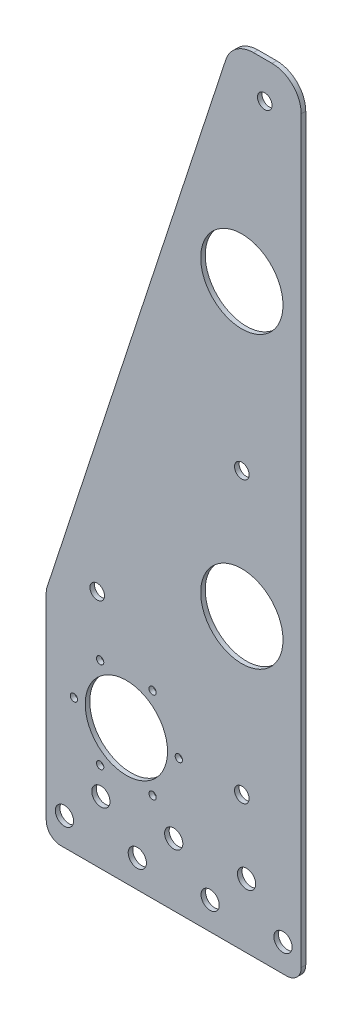
ISO-10303-21;
HEADER;
FILE_DESCRIPTION(('STEP AP214'),'2;1');
FILE_NAME('part.step','',(''),(''),'','','');
FILE_SCHEMA(('AUTOMOTIVE_DESIGN { 1 0 10303 214 1 1 1 1 }'));
ENDSEC;
DATA;
#1=APPLICATION_CONTEXT('core data for automotive mechanical design processes');
#2=APPLICATION_PROTOCOL_DEFINITION('international standard','automotive_design',2000,#1);
#3=PRODUCT_CONTEXT('',#1,'mechanical');
#4=PRODUCT('Part','Part','',(#3));
#5=PRODUCT_RELATED_PRODUCT_CATEGORY('part','',(#4));
#6=PRODUCT_DEFINITION_FORMATION('','',#4);
#7=PRODUCT_DEFINITION_CONTEXT('part definition',#1,'design');
#8=PRODUCT_DEFINITION('design','',#6,#7);
#9=PRODUCT_DEFINITION_SHAPE('','',#8);
#10=(LENGTH_UNIT() NAMED_UNIT(*) SI_UNIT(.MILLI.,.METRE.));
#11=(NAMED_UNIT(*) PLANE_ANGLE_UNIT() SI_UNIT($,.RADIAN.));
#12=(NAMED_UNIT(*) SI_UNIT($,.STERADIAN.) SOLID_ANGLE_UNIT());
#13=UNCERTAINTY_MEASURE_WITH_UNIT(LENGTH_MEASURE(1.E-05),#10,'distance_accuracy_value','');
#14=(GEOMETRIC_REPRESENTATION_CONTEXT(3) GLOBAL_UNCERTAINTY_ASSIGNED_CONTEXT((#13)) GLOBAL_UNIT_ASSIGNED_CONTEXT((#10,
#11,#12)) REPRESENTATION_CONTEXT('',''));
#15=CARTESIAN_POINT('',(0.,0.,0.));
#16=DIRECTION('',(0.,0.,1.));
#17=DIRECTION('',(1.,0.,0.));
#18=AXIS2_PLACEMENT_3D('',#15,#16,#17);
#19=CARTESIAN_POINT('',(55.6253139352506,212.09,1.5875));
#20=DIRECTION('',(0.,0.,1.));
#21=DIRECTION('',(1.,0.,0.));
#22=AXIS2_PLACEMENT_3D('',#19,#20,#21);
#23=PLANE('',#22);
#24=CARTESIAN_POINT('',(17.7799999999999,83.058,1.5875));
#25=DIRECTION('',(0.,0.,1.));
#26=DIRECTION('',(1.,0.,0.));
#27=AXIS2_PLACEMENT_3D('',#24,#25,#26);
#28=CIRCLE('',#27,2.53999999999999);
#29=CARTESIAN_POINT('',(20.3199999999999,83.058,1.5875));
#30=VERTEX_POINT('',#29);
#31=EDGE_CURVE('E336',#30,#30,#28,.T.);
#32=ORIENTED_EDGE('',*,*,#31,.F.);
#33=EDGE_LOOP('',(#32));
#34=FACE_BOUND('',#33,.T.);
#35=DIRECTION('',(0.,1.,0.));
#36=VECTOR('',#35,1.);
#37=CARTESIAN_POINT('',(88.8999999999999,212.09,1.5875));
#38=LINE('',#37,#36);
#39=CARTESIAN_POINT('',(88.9000000000002,5.08000000000001,1.5875));
#40=VERTEX_POINT('',#39);
#41=CARTESIAN_POINT('',(88.9000000000002,262.89,1.5875));
#42=VERTEX_POINT('',#41);
#43=EDGE_CURVE('E122',#40,#42,#38,.T.);
#44=ORIENTED_EDGE('',*,*,#43,.T.);
#45=CARTESIAN_POINT('',(78.7400000000002,262.89,1.5875));
#46=DIRECTION('',(0.,0.,1.));
#47=DIRECTION('',(-1.,0.,0.));
#48=AXIS2_PLACEMENT_3D('',#45,#46,#47);
#49=CIRCLE('',#48,10.16);
#50=CARTESIAN_POINT('',(78.7400000000002,273.05,1.5875));
#51=VERTEX_POINT('',#50);
#52=EDGE_CURVE('E175',#42,#51,#49,.T.);
#53=ORIENTED_EDGE('',*,*,#52,.T.);
#54=DIRECTION('',(-1.,0.,0.));
#55=VECTOR('',#54,1.);
#56=CARTESIAN_POINT('',(72.2497752500611,273.05,1.5875));
#57=LINE('',#56,#55);
#58=CARTESIAN_POINT('',(72.2497752500611,273.05,1.5875));
#59=VERTEX_POINT('',#58);
#60=EDGE_CURVE('E318',#51,#59,#57,.T.);
#61=ORIENTED_EDGE('',*,*,#60,.T.);
#62=CARTESIAN_POINT('',(72.2497752500611,262.89,1.5875));
#63=DIRECTION('',(0.,0.,1.));
#64=DIRECTION('',(-1.,0.,0.));
#65=AXIS2_PLACEMENT_3D('',#62,#63,#64);
#66=CIRCLE('',#65,10.16);
#67=CARTESIAN_POINT('',(62.5936846110183,266.049986324431,1.5875));
#68=VERTEX_POINT('',#67);
#69=EDGE_CURVE('E320',#59,#68,#66,.T.);
#70=ORIENTED_EDGE('',*,*,#69,.T.);
#71=DIRECTION('',(-0.311022276026631,-0.95040262195304,0.));
#72=VECTOR('',#71,1.);
#73=CARTESIAN_POINT('',(45.9692232962077,215.249986324431,1.5875));
#74=LINE('',#73,#72);
#75=CARTESIAN_POINT('',(0.251954680478576,75.5499863244306,1.5875));
#76=VERTEX_POINT('',#75);
#77=EDGE_CURVE('E91',#68,#76,#74,.T.);
#78=ORIENTED_EDGE('',*,*,#77,.T.);
#79=CARTESIAN_POINT('',(5.08,73.9699931622152,1.5875));
#80=DIRECTION('',(0.,0.,1.));
#81=DIRECTION('',(1.,0.,0.));
#82=AXIS2_PLACEMENT_3D('',#79,#80,#81);
#83=CIRCLE('',#82,5.08);
#84=CARTESIAN_POINT('',(0.,73.9699931622152,1.5875));
#85=VERTEX_POINT('',#84);
#86=EDGE_CURVE('E295',#76,#85,#83,.T.);
#87=ORIENTED_EDGE('',*,*,#86,.T.);
#88=DIRECTION('',(0.,-1.,0.));
#89=VECTOR('',#88,1.);
#90=CARTESIAN_POINT('',(0.,73.9699931622152,1.5875));
#91=LINE('',#90,#89);
#92=CARTESIAN_POINT('',(0.,5.07999999999999,1.5875));
#93=VERTEX_POINT('',#92);
#94=EDGE_CURVE('E108',#85,#93,#91,.T.);
#95=ORIENTED_EDGE('',*,*,#94,.T.);
#96=CARTESIAN_POINT('',(5.08000000000002,5.07999999999999,1.5875));
#97=DIRECTION('',(0.,0.,1.));
#98=DIRECTION('',(1.,0.,0.));
#99=AXIS2_PLACEMENT_3D('',#96,#97,#98);
#100=CIRCLE('',#99,5.08);
#101=CARTESIAN_POINT('',(5.08000000000002,0.,1.5875));
#102=VERTEX_POINT('',#101);
#103=EDGE_CURVE('E102',#93,#102,#100,.T.);
#104=ORIENTED_EDGE('',*,*,#103,.T.);
#105=DIRECTION('',(1.,0.,0.));
#106=VECTOR('',#105,1.);
#107=CARTESIAN_POINT('',(83.82,0.,1.5875));
#108=LINE('',#107,#106);
#109=CARTESIAN_POINT('',(83.82,-1.04083408558608E-13,1.5875));
#110=VERTEX_POINT('',#109);
#111=EDGE_CURVE('E106',#102,#110,#108,.T.);
#112=ORIENTED_EDGE('',*,*,#111,.T.);
#113=CARTESIAN_POINT('',(83.82,5.08,1.5875));
#114=DIRECTION('',(0.,0.,1.));
#115=DIRECTION('',(-1.,0.,0.));
#116=AXIS2_PLACEMENT_3D('',#113,#114,#115);
#117=CIRCLE('',#116,5.0800000000001);
#118=EDGE_CURVE('E53',#110,#40,#117,.T.);
#119=ORIENTED_EDGE('',*,*,#118,.T.);
#120=EDGE_LOOP('',(#44,#53,#61,#70,#78,#87,#95,#104,#112,#119));
#121=FACE_BOUND('',#120,.T.);
#122=CARTESIAN_POINT('',(18.7960000000001,62.8278725844102,1.5875));
#123=DIRECTION('',(0.,0.,1.));
#124=DIRECTION('',(1.,0.,0.));
#125=AXIS2_PLACEMENT_3D('',#122,#123,#124);
#126=CIRCLE('',#125,1.27000000000001);
#127=CARTESIAN_POINT('',(20.0660000000001,62.8278725844102,1.5875));
#128=VERTEX_POINT('',#127);
#129=EDGE_CURVE('E194',#128,#128,#126,.T.);
#130=ORIENTED_EDGE('',*,*,#129,.F.);
#131=EDGE_LOOP('',(#130));
#132=FACE_BOUND('',#131,.T.);
#133=CARTESIAN_POINT('',(44.45,21.844,1.5875));
#134=DIRECTION('',(0.,0.,1.));
#135=DIRECTION('',(-1.,0.,0.));
#136=AXIS2_PLACEMENT_3D('',#133,#134,#135);
#137=CIRCLE('',#136,3.175);
#138=CARTESIAN_POINT('',(41.275,21.844,1.5875));
#139=VERTEX_POINT('',#138);
#140=EDGE_CURVE('E206',#139,#139,#137,.T.);
#141=ORIENTED_EDGE('',*,*,#140,.F.);
#142=EDGE_LOOP('',(#141));
#143=FACE_BOUND('',#142,.T.);
#144=CARTESIAN_POINT('',(9.65199999999989,46.9900000000005,1.5875));
#145=DIRECTION('',(0.,0.,1.));
#146=DIRECTION('',(1.,0.,0.));
#147=AXIS2_PLACEMENT_3D('',#144,#145,#146);
#148=CIRCLE('',#147,1.27);
#149=CARTESIAN_POINT('',(10.9219999999999,46.9900000000005,1.5875));
#150=VERTEX_POINT('',#149);
#151=EDGE_CURVE('E218',#150,#150,#148,.T.);
#152=ORIENTED_EDGE('',*,*,#151,.F.);
#153=EDGE_LOOP('',(#152));
#154=FACE_BOUND('',#153,.T.);
#155=CARTESIAN_POINT('',(82.55,9.652,1.5875));
#156=DIRECTION('',(0.,0.,1.));
#157=DIRECTION('',(1.,0.,0.));
#158=AXIS2_PLACEMENT_3D('',#155,#156,#157);
#159=CIRCLE('',#158,3.175);
#160=CARTESIAN_POINT('',(85.725,9.652,1.5875));
#161=VERTEX_POINT('',#160);
#162=EDGE_CURVE('E230',#161,#161,#159,.T.);
#163=ORIENTED_EDGE('',*,*,#162,.F.);
#164=EDGE_LOOP('',(#163));
#165=FACE_BOUND('',#164,.T.);
#166=CARTESIAN_POINT('',(31.75,9.652,1.5875));
#167=DIRECTION('',(0.,0.,1.));
#168=DIRECTION('',(1.,0.,0.));
#169=AXIS2_PLACEMENT_3D('',#166,#167,#168);
#170=CIRCLE('',#169,3.175);
#171=CARTESIAN_POINT('',(34.925,9.652,1.5875));
#172=VERTEX_POINT('',#171);
#173=EDGE_CURVE('E242',#172,#172,#170,.T.);
#174=ORIENTED_EDGE('',*,*,#173,.F.);
#175=EDGE_LOOP('',(#174));
#176=FACE_BOUND('',#175,.T.);
#177=CARTESIAN_POINT('',(6.34999999999999,9.652,1.5875));
#178=DIRECTION('',(0.,0.,1.));
#179=DIRECTION('',(1.,0.,0.));
#180=AXIS2_PLACEMENT_3D('',#177,#178,#179);
#181=CIRCLE('',#180,3.175);
#182=CARTESIAN_POINT('',(9.525,9.652,1.5875));
#183=VERTEX_POINT('',#182);
#184=EDGE_CURVE('E254',#183,#183,#181,.T.);
#185=ORIENTED_EDGE('',*,*,#184,.F.);
#186=EDGE_LOOP('',(#185));
#187=FACE_BOUND('',#186,.T.);
#188=CARTESIAN_POINT('',(27.9399999999999,46.99,1.5875));
#189=DIRECTION('',(0.,0.,1.));
#190=DIRECTION('',(1.,0.,0.));
#191=AXIS2_PLACEMENT_3D('',#188,#189,#190);
#192=CIRCLE('',#191,14.351);
#193=CARTESIAN_POINT('',(42.291,46.99,1.5875));
#194=VERTEX_POINT('',#193);
#195=EDGE_CURVE('E266',#194,#194,#192,.T.);
#196=ORIENTED_EDGE('',*,*,#195,.F.);
#197=EDGE_LOOP('',(#196));
#198=FACE_BOUND('',#197,.T.);
#199=CARTESIAN_POINT('',(68.199,46.99,1.5875));
#200=DIRECTION('',(0.,0.,1.));
#201=DIRECTION('',(1.,0.,0.));
#202=AXIS2_PLACEMENT_3D('',#199,#200,#201);
#203=CIRCLE('',#202,2.54);
#204=CARTESIAN_POINT('',(70.739,46.99,1.5875));
#205=VERTEX_POINT('',#204);
#206=EDGE_CURVE('E278',#205,#205,#203,.T.);
#207=ORIENTED_EDGE('',*,*,#206,.F.);
#208=EDGE_LOOP('',(#207));
#209=FACE_BOUND('',#208,.T.);
#210=CARTESIAN_POINT('',(68.199,201.93,1.5875));
#211=DIRECTION('',(0.,0.,1.));
#212=DIRECTION('',(1.,0.,0.));
#213=AXIS2_PLACEMENT_3D('',#210,#211,#212);
#214=CIRCLE('',#213,14.351);
#215=CARTESIAN_POINT('',(82.5499999999999,201.93,1.5875));
#216=VERTEX_POINT('',#215);
#217=EDGE_CURVE('E131',#216,#216,#214,.T.);
#218=ORIENTED_EDGE('',*,*,#217,.F.);
#219=EDGE_LOOP('',(#218));
#220=FACE_BOUND('',#219,.T.);
#221=CARTESIAN_POINT('',(68.199,100.838,1.5875));
#222=DIRECTION('',(0.,0.,1.));
#223=DIRECTION('',(1.,0.,0.));
#224=AXIS2_PLACEMENT_3D('',#221,#222,#223);
#225=CIRCLE('',#224,14.351);
#226=CARTESIAN_POINT('',(82.55,100.838,1.5875));
#227=VERTEX_POINT('',#226);
#228=EDGE_CURVE('E284',#227,#227,#225,.T.);
#229=ORIENTED_EDGE('',*,*,#228,.F.);
#230=EDGE_LOOP('',(#229));
#231=FACE_BOUND('',#230,.T.);
#232=CARTESIAN_POINT('',(68.199,144.78,1.5875));
#233=DIRECTION('',(0.,0.,1.));
#234=DIRECTION('',(1.,0.,0.));
#235=AXIS2_PLACEMENT_3D('',#232,#233,#234);
#236=CIRCLE('',#235,2.54);
#237=CARTESIAN_POINT('',(70.739,144.78,1.5875));
#238=VERTEX_POINT('',#237);
#239=EDGE_CURVE('E272',#238,#238,#236,.T.);
#240=ORIENTED_EDGE('',*,*,#239,.F.);
#241=EDGE_LOOP('',(#240));
#242=FACE_BOUND('',#241,.T.);
#243=CARTESIAN_POINT('',(46.2279999999999,46.99,1.5875));
#244=DIRECTION('',(0.,0.,1.));
#245=DIRECTION('',(1.,0.,0.));
#246=AXIS2_PLACEMENT_3D('',#243,#244,#245);
#247=CIRCLE('',#246,1.27);
#248=CARTESIAN_POINT('',(47.4979999999999,46.99,1.5875));
#249=VERTEX_POINT('',#248);
#250=EDGE_CURVE('E260',#249,#249,#247,.T.);
#251=ORIENTED_EDGE('',*,*,#250,.F.);
#252=EDGE_LOOP('',(#251));
#253=FACE_BOUND('',#252,.T.);
#254=CARTESIAN_POINT('',(37.0839999999997,31.1521274155903,1.5875));
#255=DIRECTION('',(0.,0.,1.));
#256=DIRECTION('',(1.,0.,0.));
#257=AXIS2_PLACEMENT_3D('',#254,#255,#256);
#258=CIRCLE('',#257,1.27000000000014);
#259=CARTESIAN_POINT('',(38.3539999999998,31.1521274155903,1.5875));
#260=VERTEX_POINT('',#259);
#261=EDGE_CURVE('E248',#260,#260,#258,.T.);
#262=ORIENTED_EDGE('',*,*,#261,.F.);
#263=EDGE_LOOP('',(#262));
#264=FACE_BOUND('',#263,.T.);
#265=CARTESIAN_POINT('',(57.15,9.652,1.5875));
#266=DIRECTION('',(0.,0.,1.));
#267=DIRECTION('',(1.,0.,0.));
#268=AXIS2_PLACEMENT_3D('',#265,#266,#267);
#269=CIRCLE('',#268,3.17500000000001);
#270=CARTESIAN_POINT('',(60.325,9.652,1.5875));
#271=VERTEX_POINT('',#270);
#272=EDGE_CURVE('E236',#271,#271,#269,.T.);
#273=ORIENTED_EDGE('',*,*,#272,.F.);
#274=EDGE_LOOP('',(#273));
#275=FACE_BOUND('',#274,.T.);
#276=CARTESIAN_POINT('',(18.7959999999997,31.1521274155905,1.5875));
#277=DIRECTION('',(0.,0.,1.));
#278=DIRECTION('',(1.,0.,0.));
#279=AXIS2_PLACEMENT_3D('',#276,#277,#278);
#280=CIRCLE('',#279,1.27);
#281=CARTESIAN_POINT('',(20.0659999999997,31.1521274155905,1.5875));
#282=VERTEX_POINT('',#281);
#283=EDGE_CURVE('E224',#282,#282,#280,.T.);
#284=ORIENTED_EDGE('',*,*,#283,.F.);
#285=EDGE_LOOP('',(#284));
#286=FACE_BOUND('',#285,.T.);
#287=CARTESIAN_POINT('',(69.85,22.352,1.5875));
#288=DIRECTION('',(0.,0.,1.));
#289=DIRECTION('',(-1.,0.,0.));
#290=AXIS2_PLACEMENT_3D('',#287,#288,#289);
#291=CIRCLE('',#290,3.175);
#292=CARTESIAN_POINT('',(66.675,22.352,1.5875));
#293=VERTEX_POINT('',#292);
#294=EDGE_CURVE('E212',#293,#293,#291,.T.);
#295=ORIENTED_EDGE('',*,*,#294,.F.);
#296=EDGE_LOOP('',(#295));
#297=FACE_BOUND('',#296,.T.);
#298=CARTESIAN_POINT('',(19.05,21.844,1.5875));
#299=DIRECTION('',(0.,0.,1.));
#300=DIRECTION('',(-1.,0.,0.));
#301=AXIS2_PLACEMENT_3D('',#298,#299,#300);
#302=CIRCLE('',#301,3.175);
#303=CARTESIAN_POINT('',(15.875,21.844,1.5875));
#304=VERTEX_POINT('',#303);
#305=EDGE_CURVE('E200',#304,#304,#302,.T.);
#306=ORIENTED_EDGE('',*,*,#305,.F.);
#307=EDGE_LOOP('',(#306));
#308=FACE_BOUND('',#307,.T.);
#309=CARTESIAN_POINT('',(37.0840000000001,62.8278725844099,1.5875));
#310=DIRECTION('',(0.,0.,1.));
#311=DIRECTION('',(1.,0.,0.));
#312=AXIS2_PLACEMENT_3D('',#309,#310,#311);
#313=CIRCLE('',#312,1.26999999999977);
#314=CARTESIAN_POINT('',(38.3539999999999,62.8278725844099,1.5875));
#315=VERTEX_POINT('',#314);
#316=EDGE_CURVE('E186',#315,#315,#313,.T.);
#317=ORIENTED_EDGE('',*,*,#316,.F.);
#318=EDGE_LOOP('',(#317));
#319=FACE_BOUND('',#318,.T.);
#320=CARTESIAN_POINT('',(76.2000000000002,260.35,1.5875));
#321=DIRECTION('',(0.,0.,1.));
#322=DIRECTION('',(1.,0.,0.));
#323=AXIS2_PLACEMENT_3D('',#320,#321,#322);
#324=CIRCLE('',#323,2.54);
#325=CARTESIAN_POINT('',(78.7400000000002,260.35,1.5875));
#326=VERTEX_POINT('',#325);
#327=EDGE_CURVE('E330',#326,#326,#324,.T.);
#328=ORIENTED_EDGE('',*,*,#327,.F.);
#329=EDGE_LOOP('',(#328));
#330=FACE_BOUND('',#329,.T.);
#331=ADVANCED_FACE('F36',(#34,#121,#132,#143,#154,#165,#176,#187,#198,#209,#220,#231,#242,#253,
#264,#275,#286,#297,#308,#319,#330),#23,.T.);
#332=CARTESIAN_POINT('',(55.6253139352506,212.09,0.));
#333=DIRECTION('',(0.,0.,1.));
#334=DIRECTION('',(1.,0.,0.));
#335=AXIS2_PLACEMENT_3D('',#332,#333,#334);
#336=PLANE('',#335);
#337=CARTESIAN_POINT('',(17.7799999999999,83.058,0.));
#338=DIRECTION('',(0.,0.,1.));
#339=DIRECTION('',(1.,0.,0.));
#340=AXIS2_PLACEMENT_3D('',#337,#338,#339);
#341=CIRCLE('',#340,2.53999999999999);
#342=CARTESIAN_POINT('',(20.3199999999999,83.058,0.));
#343=VERTEX_POINT('',#342);
#344=EDGE_CURVE('E333',#343,#343,#341,.T.);
#345=ORIENTED_EDGE('',*,*,#344,.T.);
#346=EDGE_LOOP('',(#345));
#347=FACE_BOUND('',#346,.T.);
#348=CARTESIAN_POINT('',(78.7400000000002,262.89,0.));
#349=DIRECTION('',(0.,0.,1.));
#350=DIRECTION('',(-1.,0.,0.));
#351=AXIS2_PLACEMENT_3D('',#348,#349,#350);
#352=CIRCLE('',#351,10.16);
#353=CARTESIAN_POINT('',(88.9000000000002,262.89,0.));
#354=VERTEX_POINT('',#353);
#355=CARTESIAN_POINT('',(78.7400000000002,273.05,0.));
#356=VERTEX_POINT('',#355);
#357=EDGE_CURVE('E160',#354,#356,#352,.T.);
#358=ORIENTED_EDGE('',*,*,#357,.F.);
#359=DIRECTION('',(0.,1.,0.));
#360=VECTOR('',#359,1.);
#361=CARTESIAN_POINT('',(88.8999999999999,212.09,0.));
#362=LINE('',#361,#360);
#363=CARTESIAN_POINT('',(88.9000000000002,5.08000000000001,0.));
#364=VERTEX_POINT('',#363);
#365=EDGE_CURVE('E138',#364,#354,#362,.T.);
#366=ORIENTED_EDGE('',*,*,#365,.F.);
#367=CARTESIAN_POINT('',(83.82,5.08,0.));
#368=DIRECTION('',(0.,0.,1.));
#369=DIRECTION('',(-1.,0.,0.));
#370=AXIS2_PLACEMENT_3D('',#367,#368,#369);
#371=CIRCLE('',#370,5.0800000000001);
#372=CARTESIAN_POINT('',(83.82,-1.04083408558608E-13,0.));
#373=VERTEX_POINT('',#372);
#374=EDGE_CURVE('E83',#373,#364,#371,.T.);
#375=ORIENTED_EDGE('',*,*,#374,.F.);
#376=DIRECTION('',(1.,0.,0.));
#377=VECTOR('',#376,1.);
#378=CARTESIAN_POINT('',(83.82,0.,0.));
#379=LINE('',#378,#377);
#380=CARTESIAN_POINT('',(5.08000000000002,0.,0.));
#381=VERTEX_POINT('',#380);
#382=EDGE_CURVE('E77',#381,#373,#379,.T.);
#383=ORIENTED_EDGE('',*,*,#382,.F.);
#384=CARTESIAN_POINT('',(5.08000000000002,5.07999999999999,0.));
#385=DIRECTION('',(0.,0.,1.));
#386=DIRECTION('',(1.,0.,0.));
#387=AXIS2_PLACEMENT_3D('',#384,#385,#386);
#388=CIRCLE('',#387,5.08);
#389=CARTESIAN_POINT('',(0.,5.07999999999999,0.));
#390=VERTEX_POINT('',#389);
#391=EDGE_CURVE('E116',#390,#381,#388,.T.);
#392=ORIENTED_EDGE('',*,*,#391,.F.);
#393=DIRECTION('',(0.,-1.,0.));
#394=VECTOR('',#393,1.);
#395=CARTESIAN_POINT('',(0.,73.9699931622152,0.));
#396=LINE('',#395,#394);
#397=CARTESIAN_POINT('',(0.,73.9699931622152,0.));
#398=VERTEX_POINT('',#397);
#399=EDGE_CURVE('E133',#398,#390,#396,.T.);
#400=ORIENTED_EDGE('',*,*,#399,.F.);
#401=CARTESIAN_POINT('',(5.08,73.9699931622152,0.));
#402=DIRECTION('',(0.,0.,1.));
#403=DIRECTION('',(1.,0.,0.));
#404=AXIS2_PLACEMENT_3D('',#401,#402,#403);
#405=CIRCLE('',#404,5.08);
#406=CARTESIAN_POINT('',(0.251954680478576,75.5499863244306,0.));
#407=VERTEX_POINT('',#406);
#408=EDGE_CURVE('E130',#407,#398,#405,.T.);
#409=ORIENTED_EDGE('',*,*,#408,.F.);
#410=DIRECTION('',(-0.311022276026631,-0.95040262195304,0.));
#411=VECTOR('',#410,1.);
#412=CARTESIAN_POINT('',(45.9692232962077,215.249986324431,0.));
#413=LINE('',#412,#411);
#414=CARTESIAN_POINT('',(62.5936846110183,266.049986324431,0.));
#415=VERTEX_POINT('',#414);
#416=EDGE_CURVE('E128',#415,#407,#413,.T.);
#417=ORIENTED_EDGE('',*,*,#416,.F.);
#418=CARTESIAN_POINT('',(72.2497752500611,262.89,0.));
#419=DIRECTION('',(0.,0.,1.));
#420=DIRECTION('',(-1.,0.,0.));
#421=AXIS2_PLACEMENT_3D('',#418,#419,#420);
#422=CIRCLE('',#421,10.16);
#423=CARTESIAN_POINT('',(72.2497752500611,273.05,0.));
#424=VERTEX_POINT('',#423);
#425=EDGE_CURVE('E177',#424,#415,#422,.T.);
#426=ORIENTED_EDGE('',*,*,#425,.F.);
#427=DIRECTION('',(-1.,0.,0.));
#428=VECTOR('',#427,1.);
#429=CARTESIAN_POINT('',(72.2497752500611,273.05,0.));
#430=LINE('',#429,#428);
#431=EDGE_CURVE('E182',#356,#424,#430,.T.);
#432=ORIENTED_EDGE('',*,*,#431,.F.);
#433=EDGE_LOOP('',(#358,#366,#375,#383,#392,#400,#409,#417,#426,#432));
#434=FACE_BOUND('',#433,.T.);
#435=CARTESIAN_POINT('',(68.199,201.93,0.));
#436=DIRECTION('',(0.,0.,1.));
#437=DIRECTION('',(1.,0.,0.));
#438=AXIS2_PLACEMENT_3D('',#435,#436,#437);
#439=CIRCLE('',#438,14.351);
#440=CARTESIAN_POINT('',(82.5499999999999,201.93,0.));
#441=VERTEX_POINT('',#440);
#442=EDGE_CURVE('E287',#441,#441,#439,.T.);
#443=ORIENTED_EDGE('',*,*,#442,.T.);
#444=EDGE_LOOP('',(#443));
#445=FACE_BOUND('',#444,.T.);
#446=CARTESIAN_POINT('',(68.199,100.838,0.));
#447=DIRECTION('',(0.,0.,1.));
#448=DIRECTION('',(1.,0.,0.));
#449=AXIS2_PLACEMENT_3D('',#446,#447,#448);
#450=CIRCLE('',#449,14.351);
#451=CARTESIAN_POINT('',(82.55,100.838,0.));
#452=VERTEX_POINT('',#451);
#453=EDGE_CURVE('E281',#452,#452,#450,.T.);
#454=ORIENTED_EDGE('',*,*,#453,.T.);
#455=EDGE_LOOP('',(#454));
#456=FACE_BOUND('',#455,.T.);
#457=CARTESIAN_POINT('',(68.199,46.99,0.));
#458=DIRECTION('',(0.,0.,1.));
#459=DIRECTION('',(1.,0.,0.));
#460=AXIS2_PLACEMENT_3D('',#457,#458,#459);
#461=CIRCLE('',#460,2.54);
#462=CARTESIAN_POINT('',(70.739,46.99,0.));
#463=VERTEX_POINT('',#462);
#464=EDGE_CURVE('E275',#463,#463,#461,.T.);
#465=ORIENTED_EDGE('',*,*,#464,.T.);
#466=EDGE_LOOP('',(#465));
#467=FACE_BOUND('',#466,.T.);
#468=CARTESIAN_POINT('',(68.199,144.78,0.));
#469=DIRECTION('',(0.,0.,1.));
#470=DIRECTION('',(1.,0.,0.));
#471=AXIS2_PLACEMENT_3D('',#468,#469,#470);
#472=CIRCLE('',#471,2.54);
#473=CARTESIAN_POINT('',(70.739,144.78,0.));
#474=VERTEX_POINT('',#473);
#475=EDGE_CURVE('E269',#474,#474,#472,.T.);
#476=ORIENTED_EDGE('',*,*,#475,.T.);
#477=EDGE_LOOP('',(#476));
#478=FACE_BOUND('',#477,.T.);
#479=CARTESIAN_POINT('',(27.9399999999999,46.99,0.));
#480=DIRECTION('',(0.,0.,1.));
#481=DIRECTION('',(1.,0.,0.));
#482=AXIS2_PLACEMENT_3D('',#479,#480,#481);
#483=CIRCLE('',#482,14.351);
#484=CARTESIAN_POINT('',(42.291,46.99,0.));
#485=VERTEX_POINT('',#484);
#486=EDGE_CURVE('E263',#485,#485,#483,.T.);
#487=ORIENTED_EDGE('',*,*,#486,.T.);
#488=EDGE_LOOP('',(#487));
#489=FACE_BOUND('',#488,.T.);
#490=CARTESIAN_POINT('',(46.2279999999999,46.99,0.));
#491=DIRECTION('',(0.,0.,1.));
#492=DIRECTION('',(1.,0.,0.));
#493=AXIS2_PLACEMENT_3D('',#490,#491,#492);
#494=CIRCLE('',#493,1.27);
#495=CARTESIAN_POINT('',(47.4979999999999,46.99,0.));
#496=VERTEX_POINT('',#495);
#497=EDGE_CURVE('E257',#496,#496,#494,.T.);
#498=ORIENTED_EDGE('',*,*,#497,.T.);
#499=EDGE_LOOP('',(#498));
#500=FACE_BOUND('',#499,.T.);
#501=CARTESIAN_POINT('',(6.34999999999999,9.652,0.));
#502=DIRECTION('',(0.,0.,1.));
#503=DIRECTION('',(1.,0.,0.));
#504=AXIS2_PLACEMENT_3D('',#501,#502,#503);
#505=CIRCLE('',#504,3.175);
#506=CARTESIAN_POINT('',(9.525,9.652,0.));
#507=VERTEX_POINT('',#506);
#508=EDGE_CURVE('E251',#507,#507,#505,.T.);
#509=ORIENTED_EDGE('',*,*,#508,.T.);
#510=EDGE_LOOP('',(#509));
#511=FACE_BOUND('',#510,.T.);
#512=CARTESIAN_POINT('',(37.0839999999997,31.1521274155903,0.));
#513=DIRECTION('',(0.,0.,1.));
#514=DIRECTION('',(1.,0.,0.));
#515=AXIS2_PLACEMENT_3D('',#512,#513,#514);
#516=CIRCLE('',#515,1.27000000000014);
#517=CARTESIAN_POINT('',(38.3539999999998,31.1521274155903,0.));
#518=VERTEX_POINT('',#517);
#519=EDGE_CURVE('E245',#518,#518,#516,.T.);
#520=ORIENTED_EDGE('',*,*,#519,.T.);
#521=EDGE_LOOP('',(#520));
#522=FACE_BOUND('',#521,.T.);
#523=CARTESIAN_POINT('',(31.75,9.652,0.));
#524=DIRECTION('',(0.,0.,1.));
#525=DIRECTION('',(1.,0.,0.));
#526=AXIS2_PLACEMENT_3D('',#523,#524,#525);
#527=CIRCLE('',#526,3.175);
#528=CARTESIAN_POINT('',(34.925,9.652,0.));
#529=VERTEX_POINT('',#528);
#530=EDGE_CURVE('E239',#529,#529,#527,.T.);
#531=ORIENTED_EDGE('',*,*,#530,.T.);
#532=EDGE_LOOP('',(#531));
#533=FACE_BOUND('',#532,.T.);
#534=CARTESIAN_POINT('',(57.15,9.652,0.));
#535=DIRECTION('',(0.,0.,1.));
#536=DIRECTION('',(1.,0.,0.));
#537=AXIS2_PLACEMENT_3D('',#534,#535,#536);
#538=CIRCLE('',#537,3.17500000000001);
#539=CARTESIAN_POINT('',(60.325,9.652,0.));
#540=VERTEX_POINT('',#539);
#541=EDGE_CURVE('E233',#540,#540,#538,.T.);
#542=ORIENTED_EDGE('',*,*,#541,.T.);
#543=EDGE_LOOP('',(#542));
#544=FACE_BOUND('',#543,.T.);
#545=CARTESIAN_POINT('',(82.55,9.652,0.));
#546=DIRECTION('',(0.,0.,1.));
#547=DIRECTION('',(1.,0.,0.));
#548=AXIS2_PLACEMENT_3D('',#545,#546,#547);
#549=CIRCLE('',#548,3.175);
#550=CARTESIAN_POINT('',(85.725,9.652,0.));
#551=VERTEX_POINT('',#550);
#552=EDGE_CURVE('E227',#551,#551,#549,.T.);
#553=ORIENTED_EDGE('',*,*,#552,.T.);
#554=EDGE_LOOP('',(#553));
#555=FACE_BOUND('',#554,.T.);
#556=CARTESIAN_POINT('',(18.7959999999997,31.1521274155905,0.));
#557=DIRECTION('',(0.,0.,1.));
#558=DIRECTION('',(1.,0.,0.));
#559=AXIS2_PLACEMENT_3D('',#556,#557,#558);
#560=CIRCLE('',#559,1.27);
#561=CARTESIAN_POINT('',(20.0659999999997,31.1521274155905,0.));
#562=VERTEX_POINT('',#561);
#563=EDGE_CURVE('E221',#562,#562,#560,.T.);
#564=ORIENTED_EDGE('',*,*,#563,.T.);
#565=EDGE_LOOP('',(#564));
#566=FACE_BOUND('',#565,.T.);
#567=CARTESIAN_POINT('',(9.65199999999989,46.9900000000005,0.));
#568=DIRECTION('',(0.,0.,1.));
#569=DIRECTION('',(1.,0.,0.));
#570=AXIS2_PLACEMENT_3D('',#567,#568,#569);
#571=CIRCLE('',#570,1.27);
#572=CARTESIAN_POINT('',(10.9219999999999,46.9900000000005,0.));
#573=VERTEX_POINT('',#572);
#574=EDGE_CURVE('E215',#573,#573,#571,.T.);
#575=ORIENTED_EDGE('',*,*,#574,.T.);
#576=EDGE_LOOP('',(#575));
#577=FACE_BOUND('',#576,.T.);
#578=CARTESIAN_POINT('',(69.85,22.352,0.));
#579=DIRECTION('',(0.,0.,1.));
#580=DIRECTION('',(-1.,0.,0.));
#581=AXIS2_PLACEMENT_3D('',#578,#579,#580);
#582=CIRCLE('',#581,3.175);
#583=CARTESIAN_POINT('',(66.675,22.352,0.));
#584=VERTEX_POINT('',#583);
#585=EDGE_CURVE('E209',#584,#584,#582,.T.);
#586=ORIENTED_EDGE('',*,*,#585,.T.);
#587=EDGE_LOOP('',(#586));
#588=FACE_BOUND('',#587,.T.);
#589=CARTESIAN_POINT('',(44.45,21.844,0.));
#590=DIRECTION('',(0.,0.,1.));
#591=DIRECTION('',(-1.,0.,0.));
#592=AXIS2_PLACEMENT_3D('',#589,#590,#591);
#593=CIRCLE('',#592,3.175);
#594=CARTESIAN_POINT('',(41.275,21.844,0.));
#595=VERTEX_POINT('',#594);
#596=EDGE_CURVE('E203',#595,#595,#593,.T.);
#597=ORIENTED_EDGE('',*,*,#596,.T.);
#598=EDGE_LOOP('',(#597));
#599=FACE_BOUND('',#598,.T.);
#600=CARTESIAN_POINT('',(19.05,21.844,0.));
#601=DIRECTION('',(0.,0.,1.));
#602=DIRECTION('',(-1.,0.,0.));
#603=AXIS2_PLACEMENT_3D('',#600,#601,#602);
#604=CIRCLE('',#603,3.175);
#605=CARTESIAN_POINT('',(15.875,21.844,0.));
#606=VERTEX_POINT('',#605);
#607=EDGE_CURVE('E197',#606,#606,#604,.T.);
#608=ORIENTED_EDGE('',*,*,#607,.T.);
#609=EDGE_LOOP('',(#608));
#610=FACE_BOUND('',#609,.T.);
#611=CARTESIAN_POINT('',(18.7960000000001,62.8278725844102,0.));
#612=DIRECTION('',(0.,0.,1.));
#613=DIRECTION('',(1.,0.,0.));
#614=AXIS2_PLACEMENT_3D('',#611,#612,#613);
#615=CIRCLE('',#614,1.27000000000001);
#616=CARTESIAN_POINT('',(20.0660000000001,62.8278725844102,0.));
#617=VERTEX_POINT('',#616);
#618=EDGE_CURVE('E189',#617,#617,#615,.T.);
#619=ORIENTED_EDGE('',*,*,#618,.T.);
#620=EDGE_LOOP('',(#619));
#621=FACE_BOUND('',#620,.T.);
#622=CARTESIAN_POINT('',(37.0840000000001,62.8278725844099,0.));
#623=DIRECTION('',(0.,0.,1.));
#624=DIRECTION('',(1.,0.,0.));
#625=AXIS2_PLACEMENT_3D('',#622,#623,#624);
#626=CIRCLE('',#625,1.26999999999977);
#627=CARTESIAN_POINT('',(38.3539999999999,62.8278725844099,0.));
#628=VERTEX_POINT('',#627);
#629=EDGE_CURVE('E190',#628,#628,#626,.T.);
#630=ORIENTED_EDGE('',*,*,#629,.T.);
#631=EDGE_LOOP('',(#630));
#632=FACE_BOUND('',#631,.T.);
#633=CARTESIAN_POINT('',(76.2000000000002,260.35,0.));
#634=DIRECTION('',(0.,0.,1.));
#635=DIRECTION('',(1.,0.,0.));
#636=AXIS2_PLACEMENT_3D('',#633,#634,#635);
#637=CIRCLE('',#636,2.54);
#638=CARTESIAN_POINT('',(78.7400000000002,260.35,0.));
#639=VERTEX_POINT('',#638);
#640=EDGE_CURVE('E324',#639,#639,#637,.T.);
#641=ORIENTED_EDGE('',*,*,#640,.T.);
#642=EDGE_LOOP('',(#641));
#643=FACE_BOUND('',#642,.T.);
#644=ADVANCED_FACE('F153',(#347,#434,#445,#456,#467,#478,#489,#500,#511,#522,#533,#544,#555,
#566,#577,#588,#599,#610,#621,#632,#643),#336,.F.);
#645=CARTESIAN_POINT('',(45.9692232962077,215.249986324431,1.5875));
#646=DIRECTION('',(0.95040262195304,-0.311022276026631,0.));
#647=DIRECTION('',(0.311022276026631,0.950402621953041,0.));
#648=AXIS2_PLACEMENT_3D('',#645,#646,#647);
#649=PLANE('',#648);
#650=ORIENTED_EDGE('',*,*,#416,.T.);
#651=DIRECTION('',(0.,0.,-1.));
#652=VECTOR('',#651,1.);
#653=CARTESIAN_POINT('',(0.251954680478576,75.5499863244306,1.5875));
#654=LINE('',#653,#652);
#655=EDGE_CURVE('E11',#76,#407,#654,.T.);
#656=ORIENTED_EDGE('',*,*,#655,.F.);
#657=ORIENTED_EDGE('',*,*,#77,.F.);
#658=DIRECTION('',(0.,0.,1.));
#659=VECTOR('',#658,1.);
#660=CARTESIAN_POINT('',(62.5936846110183,266.049986324431,0.));
#661=LINE('',#660,#659);
#662=EDGE_CURVE('E193',#415,#68,#661,.T.);
#663=ORIENTED_EDGE('',*,*,#662,.F.);
#664=EDGE_LOOP('',(#650,#656,#657,#663));
#665=FACE_BOUND('',#664,.T.);
#666=ADVANCED_FACE('F38',(#665),#649,.F.);
#667=CARTESIAN_POINT('',(5.08,73.9699931622152,1.5875));
#668=DIRECTION('',(0.,0.,-1.));
#669=DIRECTION('',(-1.,0.,0.));
#670=AXIS2_PLACEMENT_3D('',#667,#668,#669);
#671=CYLINDRICAL_SURFACE('',#670,5.08);
#672=ORIENTED_EDGE('',*,*,#408,.T.);
#673=DIRECTION('',(0.,0.,-1.));
#674=VECTOR('',#673,1.);
#675=CARTESIAN_POINT('',(0.,73.9699931622152,1.5875));
#676=LINE('',#675,#674);
#677=EDGE_CURVE('E45',#85,#398,#676,.T.);
#678=ORIENTED_EDGE('',*,*,#677,.F.);
#679=ORIENTED_EDGE('',*,*,#86,.F.);
#680=ORIENTED_EDGE('',*,*,#655,.T.);
#681=EDGE_LOOP('',(#672,#678,#679,#680));
#682=FACE_BOUND('',#681,.T.);
#683=ADVANCED_FACE('F296',(#682),#671,.T.);
#684=CARTESIAN_POINT('',(0.,73.9699931622152,1.5875));
#685=DIRECTION('',(1.,0.,0.));
#686=DIRECTION('',(0.,1.,0.));
#687=AXIS2_PLACEMENT_3D('',#684,#685,#686);
#688=PLANE('',#687);
#689=ORIENTED_EDGE('',*,*,#399,.T.);
#690=DIRECTION('',(0.,0.,-1.));
#691=VECTOR('',#690,1.);
#692=CARTESIAN_POINT('',(0.,5.07999999999999,1.5875));
#693=LINE('',#692,#691);
#694=EDGE_CURVE('E117',#93,#390,#693,.T.);
#695=ORIENTED_EDGE('',*,*,#694,.F.);
#696=ORIENTED_EDGE('',*,*,#94,.F.);
#697=ORIENTED_EDGE('',*,*,#677,.T.);
#698=EDGE_LOOP('',(#689,#695,#696,#697));
#699=FACE_BOUND('',#698,.T.);
#700=ADVANCED_FACE('F147',(#699),#688,.F.);
#701=CARTESIAN_POINT('',(5.08000000000002,5.07999999999999,1.5875));
#702=DIRECTION('',(0.,0.,-1.));
#703=DIRECTION('',(-1.,0.,0.));
#704=AXIS2_PLACEMENT_3D('',#701,#702,#703);
#705=CYLINDRICAL_SURFACE('',#704,5.08);
#706=ORIENTED_EDGE('',*,*,#391,.T.);
#707=DIRECTION('',(0.,0.,-1.));
#708=VECTOR('',#707,1.);
#709=CARTESIAN_POINT('',(5.08000000000002,0.,1.5875));
#710=LINE('',#709,#708);
#711=EDGE_CURVE('E113',#102,#381,#710,.T.);
#712=ORIENTED_EDGE('',*,*,#711,.F.);
#713=ORIENTED_EDGE('',*,*,#103,.F.);
#714=ORIENTED_EDGE('',*,*,#694,.T.);
#715=EDGE_LOOP('',(#706,#712,#713,#714));
#716=FACE_BOUND('',#715,.T.);
#717=ADVANCED_FACE('F114',(#716),#705,.T.);
#718=CARTESIAN_POINT('',(83.82,0.,1.5875));
#719=DIRECTION('',(0.,1.,0.));
#720=DIRECTION('',(-1.,0.,0.));
#721=AXIS2_PLACEMENT_3D('',#718,#719,#720);
#722=PLANE('',#721);
#723=ORIENTED_EDGE('',*,*,#382,.T.);
#724=DIRECTION('',(0.,0.,-1.));
#725=VECTOR('',#724,1.);
#726=CARTESIAN_POINT('',(83.82,-1.04083408558608E-13,1.5875));
#727=LINE('',#726,#725);
#728=EDGE_CURVE('E118',#110,#373,#727,.T.);
#729=ORIENTED_EDGE('',*,*,#728,.F.);
#730=ORIENTED_EDGE('',*,*,#111,.F.);
#731=ORIENTED_EDGE('',*,*,#711,.T.);
#732=EDGE_LOOP('',(#723,#729,#730,#731));
#733=FACE_BOUND('',#732,.T.);
#734=ADVANCED_FACE('F120',(#733),#722,.F.);
#735=CARTESIAN_POINT('',(83.82,5.08,1.5875));
#736=DIRECTION('',(0.,0.,-1.));
#737=DIRECTION('',(-1.,0.,0.));
#738=AXIS2_PLACEMENT_3D('',#735,#736,#737);
#739=CYLINDRICAL_SURFACE('',#738,5.0800000000001);
#740=ORIENTED_EDGE('',*,*,#374,.T.);
#741=DIRECTION('',(0.,0.,-1.));
#742=VECTOR('',#741,1.);
#743=CARTESIAN_POINT('',(88.9000000000002,5.08000000000001,1.5875));
#744=LINE('',#743,#742);
#745=EDGE_CURVE('E127',#40,#364,#744,.T.);
#746=ORIENTED_EDGE('',*,*,#745,.F.);
#747=ORIENTED_EDGE('',*,*,#118,.F.);
#748=ORIENTED_EDGE('',*,*,#728,.T.);
#749=EDGE_LOOP('',(#740,#746,#747,#748));
#750=FACE_BOUND('',#749,.T.);
#751=ADVANCED_FACE('F362',(#750),#739,.T.);
#752=CARTESIAN_POINT('',(88.8999999999999,212.09,1.5875));
#753=DIRECTION('',(-1.,0.,0.));
#754=DIRECTION('',(0.,-1.,0.));
#755=AXIS2_PLACEMENT_3D('',#752,#753,#754);
#756=PLANE('',#755);
#757=ORIENTED_EDGE('',*,*,#365,.T.);
#758=DIRECTION('',(0.,0.,1.));
#759=VECTOR('',#758,1.);
#760=CARTESIAN_POINT('',(88.9000000000002,262.89,0.));
#761=LINE('',#760,#759);
#762=EDGE_CURVE('E167',#354,#42,#761,.T.);
#763=ORIENTED_EDGE('',*,*,#762,.T.);
#764=ORIENTED_EDGE('',*,*,#43,.F.);
#765=ORIENTED_EDGE('',*,*,#745,.T.);
#766=EDGE_LOOP('',(#757,#763,#764,#765));
#767=FACE_BOUND('',#766,.T.);
#768=ADVANCED_FACE('F164',(#767),#756,.F.);
#769=CARTESIAN_POINT('',(68.199,201.93,1.5875));
#770=DIRECTION('',(0.,0.,-1.));
#771=DIRECTION('',(-1.,0.,0.));
#772=AXIS2_PLACEMENT_3D('',#769,#770,#771);
#773=CYLINDRICAL_SURFACE('',#772,14.351);
#774=ORIENTED_EDGE('',*,*,#217,.T.);
#775=EDGE_LOOP('',(#774));
#776=FACE_BOUND('',#775,.T.);
#777=ORIENTED_EDGE('',*,*,#442,.F.);
#778=EDGE_LOOP('',(#777));
#779=FACE_BOUND('',#778,.T.);
#780=ADVANCED_FACE('F357',(#776,#779),#773,.F.);
#781=CARTESIAN_POINT('',(68.199,100.838,1.5875));
#782=DIRECTION('',(0.,0.,-1.));
#783=DIRECTION('',(-1.,0.,0.));
#784=AXIS2_PLACEMENT_3D('',#781,#782,#783);
#785=CYLINDRICAL_SURFACE('',#784,14.351);
#786=ORIENTED_EDGE('',*,*,#228,.T.);
#787=EDGE_LOOP('',(#786));
#788=FACE_BOUND('',#787,.T.);
#789=ORIENTED_EDGE('',*,*,#453,.F.);
#790=EDGE_LOOP('',(#789));
#791=FACE_BOUND('',#790,.T.);
#792=ADVANCED_FACE('F544',(#788,#791),#785,.F.);
#793=CARTESIAN_POINT('',(68.199,46.99,1.5875));
#794=DIRECTION('',(0.,0.,-1.));
#795=DIRECTION('',(-1.,0.,0.));
#796=AXIS2_PLACEMENT_3D('',#793,#794,#795);
#797=CYLINDRICAL_SURFACE('',#796,2.54);
#798=ORIENTED_EDGE('',*,*,#206,.T.);
#799=EDGE_LOOP('',(#798));
#800=FACE_BOUND('',#799,.T.);
#801=ORIENTED_EDGE('',*,*,#464,.F.);
#802=EDGE_LOOP('',(#801));
#803=FACE_BOUND('',#802,.T.);
#804=ADVANCED_FACE('F536',(#800,#803),#797,.F.);
#805=CARTESIAN_POINT('',(68.199,144.78,1.5875));
#806=DIRECTION('',(0.,0.,-1.));
#807=DIRECTION('',(-1.,0.,0.));
#808=AXIS2_PLACEMENT_3D('',#805,#806,#807);
#809=CYLINDRICAL_SURFACE('',#808,2.54);
#810=ORIENTED_EDGE('',*,*,#239,.T.);
#811=EDGE_LOOP('',(#810));
#812=FACE_BOUND('',#811,.T.);
#813=ORIENTED_EDGE('',*,*,#475,.F.);
#814=EDGE_LOOP('',(#813));
#815=FACE_BOUND('',#814,.T.);
#816=ADVANCED_FACE('F528',(#812,#815),#809,.F.);
#817=CARTESIAN_POINT('',(27.9399999999999,46.99,1.5875));
#818=DIRECTION('',(0.,0.,-1.));
#819=DIRECTION('',(-1.,0.,0.));
#820=AXIS2_PLACEMENT_3D('',#817,#818,#819);
#821=CYLINDRICAL_SURFACE('',#820,14.351);
#822=ORIENTED_EDGE('',*,*,#195,.T.);
#823=EDGE_LOOP('',(#822));
#824=FACE_BOUND('',#823,.T.);
#825=ORIENTED_EDGE('',*,*,#486,.F.);
#826=EDGE_LOOP('',(#825));
#827=FACE_BOUND('',#826,.T.);
#828=ADVANCED_FACE('F520',(#824,#827),#821,.F.);
#829=CARTESIAN_POINT('',(46.2279999999999,46.99,1.5875));
#830=DIRECTION('',(0.,0.,-1.));
#831=DIRECTION('',(-1.,0.,0.));
#832=AXIS2_PLACEMENT_3D('',#829,#830,#831);
#833=CYLINDRICAL_SURFACE('',#832,1.27);
#834=ORIENTED_EDGE('',*,*,#250,.T.);
#835=EDGE_LOOP('',(#834));
#836=FACE_BOUND('',#835,.T.);
#837=ORIENTED_EDGE('',*,*,#497,.F.);
#838=EDGE_LOOP('',(#837));
#839=FACE_BOUND('',#838,.T.);
#840=ADVANCED_FACE('F512',(#836,#839),#833,.F.);
#841=CARTESIAN_POINT('',(6.34999999999999,9.652,1.5875));
#842=DIRECTION('',(0.,0.,-1.));
#843=DIRECTION('',(-1.,0.,0.));
#844=AXIS2_PLACEMENT_3D('',#841,#842,#843);
#845=CYLINDRICAL_SURFACE('',#844,3.175);
#846=ORIENTED_EDGE('',*,*,#184,.T.);
#847=EDGE_LOOP('',(#846));
#848=FACE_BOUND('',#847,.T.);
#849=ORIENTED_EDGE('',*,*,#508,.F.);
#850=EDGE_LOOP('',(#849));
#851=FACE_BOUND('',#850,.T.);
#852=ADVANCED_FACE('F504',(#848,#851),#845,.F.);
#853=CARTESIAN_POINT('',(37.0839999999997,31.1521274155903,1.5875));
#854=DIRECTION('',(0.,0.,-1.));
#855=DIRECTION('',(-1.,0.,0.));
#856=AXIS2_PLACEMENT_3D('',#853,#854,#855);
#857=CYLINDRICAL_SURFACE('',#856,1.27000000000014);
#858=ORIENTED_EDGE('',*,*,#261,.T.);
#859=EDGE_LOOP('',(#858));
#860=FACE_BOUND('',#859,.T.);
#861=ORIENTED_EDGE('',*,*,#519,.F.);
#862=EDGE_LOOP('',(#861));
#863=FACE_BOUND('',#862,.T.);
#864=ADVANCED_FACE('F496',(#860,#863),#857,.F.);
#865=CARTESIAN_POINT('',(31.75,9.652,1.5875));
#866=DIRECTION('',(0.,0.,-1.));
#867=DIRECTION('',(-1.,0.,0.));
#868=AXIS2_PLACEMENT_3D('',#865,#866,#867);
#869=CYLINDRICAL_SURFACE('',#868,3.175);
#870=ORIENTED_EDGE('',*,*,#173,.T.);
#871=EDGE_LOOP('',(#870));
#872=FACE_BOUND('',#871,.T.);
#873=ORIENTED_EDGE('',*,*,#530,.F.);
#874=EDGE_LOOP('',(#873));
#875=FACE_BOUND('',#874,.T.);
#876=ADVANCED_FACE('F488',(#872,#875),#869,.F.);
#877=CARTESIAN_POINT('',(57.15,9.652,1.5875));
#878=DIRECTION('',(0.,0.,-1.));
#879=DIRECTION('',(-1.,0.,0.));
#880=AXIS2_PLACEMENT_3D('',#877,#878,#879);
#881=CYLINDRICAL_SURFACE('',#880,3.17500000000001);
#882=ORIENTED_EDGE('',*,*,#272,.T.);
#883=EDGE_LOOP('',(#882));
#884=FACE_BOUND('',#883,.T.);
#885=ORIENTED_EDGE('',*,*,#541,.F.);
#886=EDGE_LOOP('',(#885));
#887=FACE_BOUND('',#886,.T.);
#888=ADVANCED_FACE('F480',(#884,#887),#881,.F.);
#889=CARTESIAN_POINT('',(82.55,9.652,1.5875));
#890=DIRECTION('',(0.,0.,-1.));
#891=DIRECTION('',(-1.,0.,0.));
#892=AXIS2_PLACEMENT_3D('',#889,#890,#891);
#893=CYLINDRICAL_SURFACE('',#892,3.175);
#894=ORIENTED_EDGE('',*,*,#162,.T.);
#895=EDGE_LOOP('',(#894));
#896=FACE_BOUND('',#895,.T.);
#897=ORIENTED_EDGE('',*,*,#552,.F.);
#898=EDGE_LOOP('',(#897));
#899=FACE_BOUND('',#898,.T.);
#900=ADVANCED_FACE('F472',(#896,#899),#893,.F.);
#901=CARTESIAN_POINT('',(18.7959999999997,31.1521274155905,1.5875));
#902=DIRECTION('',(0.,0.,-1.));
#903=DIRECTION('',(-1.,0.,0.));
#904=AXIS2_PLACEMENT_3D('',#901,#902,#903);
#905=CYLINDRICAL_SURFACE('',#904,1.27);
#906=ORIENTED_EDGE('',*,*,#283,.T.);
#907=EDGE_LOOP('',(#906));
#908=FACE_BOUND('',#907,.T.);
#909=ORIENTED_EDGE('',*,*,#563,.F.);
#910=EDGE_LOOP('',(#909));
#911=FACE_BOUND('',#910,.T.);
#912=ADVANCED_FACE('F464',(#908,#911),#905,.F.);
#913=CARTESIAN_POINT('',(9.65199999999989,46.9900000000005,1.5875));
#914=DIRECTION('',(0.,0.,-1.));
#915=DIRECTION('',(-1.,0.,0.));
#916=AXIS2_PLACEMENT_3D('',#913,#914,#915);
#917=CYLINDRICAL_SURFACE('',#916,1.27);
#918=ORIENTED_EDGE('',*,*,#151,.T.);
#919=EDGE_LOOP('',(#918));
#920=FACE_BOUND('',#919,.T.);
#921=ORIENTED_EDGE('',*,*,#574,.F.);
#922=EDGE_LOOP('',(#921));
#923=FACE_BOUND('',#922,.T.);
#924=ADVANCED_FACE('F456',(#920,#923),#917,.F.);
#925=CARTESIAN_POINT('',(69.85,22.352,1.5875));
#926=DIRECTION('',(0.,0.,-1.));
#927=DIRECTION('',(-1.,0.,0.));
#928=AXIS2_PLACEMENT_3D('',#925,#926,#927);
#929=CYLINDRICAL_SURFACE('',#928,3.175);
#930=ORIENTED_EDGE('',*,*,#294,.T.);
#931=EDGE_LOOP('',(#930));
#932=FACE_BOUND('',#931,.T.);
#933=ORIENTED_EDGE('',*,*,#585,.F.);
#934=EDGE_LOOP('',(#933));
#935=FACE_BOUND('',#934,.T.);
#936=ADVANCED_FACE('F448',(#932,#935),#929,.F.);
#937=CARTESIAN_POINT('',(44.45,21.844,1.5875));
#938=DIRECTION('',(0.,0.,-1.));
#939=DIRECTION('',(-1.,0.,0.));
#940=AXIS2_PLACEMENT_3D('',#937,#938,#939);
#941=CYLINDRICAL_SURFACE('',#940,3.175);
#942=ORIENTED_EDGE('',*,*,#140,.T.);
#943=EDGE_LOOP('',(#942));
#944=FACE_BOUND('',#943,.T.);
#945=ORIENTED_EDGE('',*,*,#596,.F.);
#946=EDGE_LOOP('',(#945));
#947=FACE_BOUND('',#946,.T.);
#948=ADVANCED_FACE('F440',(#944,#947),#941,.F.);
#949=CARTESIAN_POINT('',(19.05,21.844,1.5875));
#950=DIRECTION('',(0.,0.,-1.));
#951=DIRECTION('',(-1.,0.,0.));
#952=AXIS2_PLACEMENT_3D('',#949,#950,#951);
#953=CYLINDRICAL_SURFACE('',#952,3.175);
#954=ORIENTED_EDGE('',*,*,#305,.T.);
#955=EDGE_LOOP('',(#954));
#956=FACE_BOUND('',#955,.T.);
#957=ORIENTED_EDGE('',*,*,#607,.F.);
#958=EDGE_LOOP('',(#957));
#959=FACE_BOUND('',#958,.T.);
#960=ADVANCED_FACE('F432',(#956,#959),#953,.F.);
#961=CARTESIAN_POINT('',(18.7960000000001,62.8278725844102,1.5875));
#962=DIRECTION('',(0.,0.,-1.));
#963=DIRECTION('',(-1.,0.,0.));
#964=AXIS2_PLACEMENT_3D('',#961,#962,#963);
#965=CYLINDRICAL_SURFACE('',#964,1.27000000000001);
#966=ORIENTED_EDGE('',*,*,#129,.T.);
#967=EDGE_LOOP('',(#966));
#968=FACE_BOUND('',#967,.T.);
#969=ORIENTED_EDGE('',*,*,#618,.F.);
#970=EDGE_LOOP('',(#969));
#971=FACE_BOUND('',#970,.T.);
#972=ADVANCED_FACE('F424',(#968,#971),#965,.F.);
#973=CARTESIAN_POINT('',(37.0840000000001,62.8278725844099,1.5875));
#974=DIRECTION('',(0.,0.,-1.));
#975=DIRECTION('',(-1.,0.,0.));
#976=AXIS2_PLACEMENT_3D('',#973,#974,#975);
#977=CYLINDRICAL_SURFACE('',#976,1.26999999999977);
#978=ORIENTED_EDGE('',*,*,#316,.T.);
#979=EDGE_LOOP('',(#978));
#980=FACE_BOUND('',#979,.T.);
#981=ORIENTED_EDGE('',*,*,#629,.F.);
#982=EDGE_LOOP('',(#981));
#983=FACE_BOUND('',#982,.T.);
#984=ADVANCED_FACE('F418',(#980,#983),#977,.F.);
#985=CARTESIAN_POINT('',(72.2497752500611,262.89,0.));
#986=DIRECTION('',(0.,0.,1.));
#987=DIRECTION('',(1.,0.,0.));
#988=AXIS2_PLACEMENT_3D('',#985,#986,#987);
#989=CYLINDRICAL_SURFACE('',#988,10.16);
#990=ORIENTED_EDGE('',*,*,#69,.F.);
#991=DIRECTION('',(0.,0.,1.));
#992=VECTOR('',#991,1.);
#993=CARTESIAN_POINT('',(72.2497752500611,273.05,0.));
#994=LINE('',#993,#992);
#995=EDGE_CURVE('E179',#424,#59,#994,.T.);
#996=ORIENTED_EDGE('',*,*,#995,.F.);
#997=ORIENTED_EDGE('',*,*,#425,.T.);
#998=ORIENTED_EDGE('',*,*,#662,.T.);
#999=EDGE_LOOP('',(#990,#996,#997,#998));
#1000=FACE_BOUND('',#999,.T.);
#1001=ADVANCED_FACE('F321',(#1000),#989,.T.);
#1002=CARTESIAN_POINT('',(72.2497752500611,273.05,0.));
#1003=DIRECTION('',(0.,1.,0.));
#1004=DIRECTION('',(0.,0.,1.));
#1005=AXIS2_PLACEMENT_3D('',#1002,#1003,#1004);
#1006=PLANE('',#1005);
#1007=ORIENTED_EDGE('',*,*,#60,.F.);
#1008=DIRECTION('',(0.,0.,1.));
#1009=VECTOR('',#1008,1.);
#1010=CARTESIAN_POINT('',(78.7400000000002,273.05,0.));
#1011=LINE('',#1010,#1009);
#1012=EDGE_CURVE('E176',#356,#51,#1011,.T.);
#1013=ORIENTED_EDGE('',*,*,#1012,.F.);
#1014=ORIENTED_EDGE('',*,*,#431,.T.);
#1015=ORIENTED_EDGE('',*,*,#995,.T.);
#1016=EDGE_LOOP('',(#1007,#1013,#1014,#1015));
#1017=FACE_BOUND('',#1016,.T.);
#1018=ADVANCED_FACE('F315',(#1017),#1006,.T.);
#1019=CARTESIAN_POINT('',(78.7400000000002,262.89,0.));
#1020=DIRECTION('',(0.,0.,1.));
#1021=DIRECTION('',(1.,0.,0.));
#1022=AXIS2_PLACEMENT_3D('',#1019,#1020,#1021);
#1023=CYLINDRICAL_SURFACE('',#1022,10.16);
#1024=ORIENTED_EDGE('',*,*,#52,.F.);
#1025=ORIENTED_EDGE('',*,*,#762,.F.);
#1026=ORIENTED_EDGE('',*,*,#357,.T.);
#1027=ORIENTED_EDGE('',*,*,#1012,.T.);
#1028=EDGE_LOOP('',(#1024,#1025,#1026,#1027));
#1029=FACE_BOUND('',#1028,.T.);
#1030=ADVANCED_FACE('F172',(#1029),#1023,.T.);
#1031=CARTESIAN_POINT('',(76.2000000000002,260.35,0.));
#1032=DIRECTION('',(0.,0.,1.));
#1033=DIRECTION('',(1.,0.,0.));
#1034=AXIS2_PLACEMENT_3D('',#1031,#1032,#1033);
#1035=CYLINDRICAL_SURFACE('',#1034,2.54);
#1036=ORIENTED_EDGE('',*,*,#640,.F.);
#1037=EDGE_LOOP('',(#1036));
#1038=FACE_BOUND('',#1037,.T.);
#1039=ORIENTED_EDGE('',*,*,#327,.T.);
#1040=EDGE_LOOP('',(#1039));
#1041=FACE_BOUND('',#1040,.T.);
#1042=ADVANCED_FACE('F346',(#1038,#1041),#1035,.F.);
#1043=CARTESIAN_POINT('',(17.7799999999999,83.058,0.));
#1044=DIRECTION('',(0.,0.,1.));
#1045=DIRECTION('',(1.,0.,0.));
#1046=AXIS2_PLACEMENT_3D('',#1043,#1044,#1045);
#1047=CYLINDRICAL_SURFACE('',#1046,2.53999999999999);
#1048=ORIENTED_EDGE('',*,*,#344,.F.);
#1049=EDGE_LOOP('',(#1048));
#1050=FACE_BOUND('',#1049,.T.);
#1051=ORIENTED_EDGE('',*,*,#31,.T.);
#1052=EDGE_LOOP('',(#1051));
#1053=FACE_BOUND('',#1052,.T.);
#1054=ADVANCED_FACE('F343',(#1050,#1053),#1047,.F.);
#1055=CLOSED_SHELL('',(#331,#644,#666,#683,#700,#717,#734,#751,#768,#780,#792,#804,#816,#828,
#840,#852,#864,#876,#888,#900,#912,#924,#936,#948,#960,#972,#984,#1001,#1018,#1030,#1042,#1054));
#1056=MANIFOLD_SOLID_BREP('B2',#1055);
#1057=ADVANCED_BREP_SHAPE_REPRESENTATION('',(#18,#1056),#14);
#1058=SHAPE_DEFINITION_REPRESENTATION(#9,#1057);
ENDSEC;
END-ISO-10303-21;
